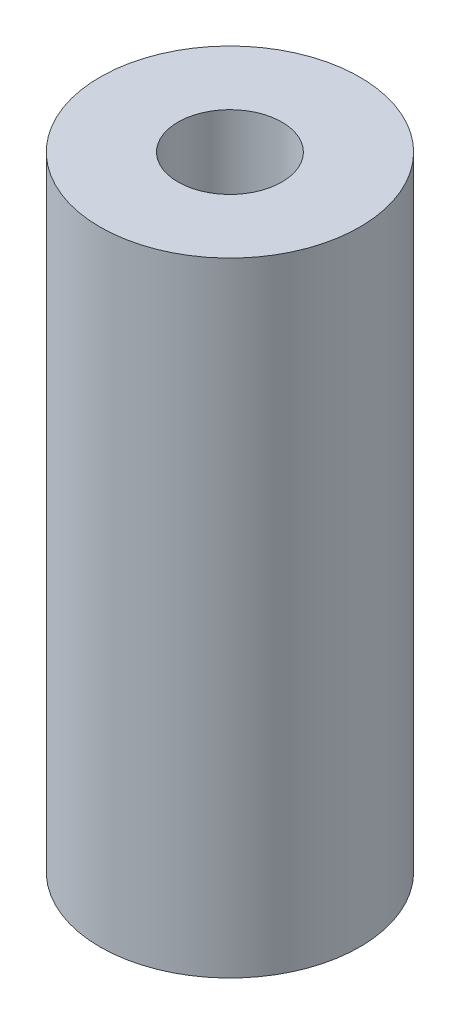
ISO-10303-21;
HEADER;
FILE_DESCRIPTION(('STEP AP214'),'2;1');
FILE_NAME('part.step','',(''),(''),'','','');
FILE_SCHEMA(('AUTOMOTIVE_DESIGN { 1 0 10303 214 1 1 1 1 }'));
ENDSEC;
DATA;
#1=APPLICATION_CONTEXT('core data for automotive mechanical design processes');
#2=APPLICATION_PROTOCOL_DEFINITION('international standard','automotive_design',2000,#1);
#3=PRODUCT_CONTEXT('',#1,'mechanical');
#4=PRODUCT('Part','Part','',(#3));
#5=PRODUCT_RELATED_PRODUCT_CATEGORY('part','',(#4));
#6=PRODUCT_DEFINITION_FORMATION('','',#4);
#7=PRODUCT_DEFINITION_CONTEXT('part definition',#1,'design');
#8=PRODUCT_DEFINITION('design','',#6,#7);
#9=PRODUCT_DEFINITION_SHAPE('','',#8);
#10=(LENGTH_UNIT() NAMED_UNIT(*) SI_UNIT(.MILLI.,.METRE.));
#11=(NAMED_UNIT(*) PLANE_ANGLE_UNIT() SI_UNIT($,.RADIAN.));
#12=(NAMED_UNIT(*) SI_UNIT($,.STERADIAN.) SOLID_ANGLE_UNIT());
#13=UNCERTAINTY_MEASURE_WITH_UNIT(LENGTH_MEASURE(1.E-05),#10,'distance_accuracy_value','');
#14=(GEOMETRIC_REPRESENTATION_CONTEXT(3) GLOBAL_UNCERTAINTY_ASSIGNED_CONTEXT((#13)) GLOBAL_UNIT_ASSIGNED_CONTEXT((#10,
#11,#12)) REPRESENTATION_CONTEXT('',''));
#15=CARTESIAN_POINT('',(0.,0.,0.));
#16=DIRECTION('',(0.,0.,1.));
#17=DIRECTION('',(1.,0.,0.));
#18=AXIS2_PLACEMENT_3D('',#15,#16,#17);
#19=CARTESIAN_POINT('',(5.,0.,0.));
#20=DIRECTION('',(0.,1.,0.));
#21=DIRECTION('',(0.,0.,1.));
#22=AXIS2_PLACEMENT_3D('',#19,#20,#21);
#23=PLANE('',#22);
#24=CARTESIAN_POINT('',(0.,0.,0.));
#25=DIRECTION('',(0.,1.,0.));
#26=DIRECTION('',(0.,0.,1.));
#27=AXIS2_PLACEMENT_3D('',#24,#25,#26);
#28=CIRCLE('',#27,5.);
#29=CARTESIAN_POINT('',(0.,0.,5.));
#30=VERTEX_POINT('',#29);
#31=EDGE_CURVE('E49',#30,#30,#28,.T.);
#32=ORIENTED_EDGE('',*,*,#31,.F.);
#33=EDGE_LOOP('',(#32));
#34=FACE_BOUND('',#33,.T.);
#35=CARTESIAN_POINT('',(0.,0.,0.));
#36=DIRECTION('',(0.,1.,0.));
#37=DIRECTION('',(0.,0.,1.));
#38=AXIS2_PLACEMENT_3D('',#35,#36,#37);
#39=CIRCLE('',#38,3.);
#40=CARTESIAN_POINT('',(0.,0.,3.));
#41=VERTEX_POINT('',#40);
#42=EDGE_CURVE('E10',#41,#41,#39,.T.);
#43=ORIENTED_EDGE('',*,*,#42,.T.);
#44=EDGE_LOOP('',(#43));
#45=FACE_BOUND('',#44,.T.);
#46=ADVANCED_FACE('F30',(#34,#45),#23,.F.);
#47=CARTESIAN_POINT('',(0.,10.8397414939025,0.));
#48=DIRECTION('',(0.,1.,0.));
#49=DIRECTION('',(0.,0.,1.));
#50=AXIS2_PLACEMENT_3D('',#47,#48,#49);
#51=CYLINDRICAL_SURFACE('',#50,3.);
#52=CARTESIAN_POINT('',(0.,13.,0.));
#53=DIRECTION('',(0.,-1.,0.));
#54=DIRECTION('',(0.,0.,-1.));
#55=AXIS2_PLACEMENT_3D('',#52,#53,#54);
#56=CIRCLE('',#55,3.);
#57=CARTESIAN_POINT('',(0.,13.,-3.));
#58=VERTEX_POINT('',#57);
#59=EDGE_CURVE('E52',#58,#58,#56,.T.);
#60=ORIENTED_EDGE('',*,*,#59,.F.);
#61=EDGE_LOOP('',(#60));
#62=FACE_BOUND('',#61,.T.);
#63=ORIENTED_EDGE('',*,*,#42,.F.);
#64=EDGE_LOOP('',(#63));
#65=FACE_BOUND('',#64,.T.);
#66=ADVANCED_FACE('F79',(#62,#65),#51,.F.);
#67=CARTESIAN_POINT('',(0.,10.8397414939025,0.));
#68=DIRECTION('',(0.,1.,0.));
#69=DIRECTION('',(0.,0.,1.));
#70=AXIS2_PLACEMENT_3D('',#67,#68,#69);
#71=CYLINDRICAL_SURFACE('',#70,2.);
#72=CARTESIAN_POINT('',(0.,18.,0.));
#73=DIRECTION('',(0.,1.,0.));
#74=DIRECTION('',(0.,0.,1.));
#75=AXIS2_PLACEMENT_3D('',#72,#73,#74);
#76=CIRCLE('',#75,2.);
#77=CARTESIAN_POINT('',(0.,18.,2.));
#78=VERTEX_POINT('',#77);
#79=EDGE_CURVE('E36',#78,#78,#76,.T.);
#80=ORIENTED_EDGE('',*,*,#79,.F.);
#81=EDGE_LOOP('',(#80));
#82=FACE_BOUND('',#81,.T.);
#83=CARTESIAN_POINT('',(0.,24.,0.));
#84=DIRECTION('',(0.,1.,0.));
#85=DIRECTION('',(0.,0.,1.));
#86=AXIS2_PLACEMENT_3D('',#83,#84,#85);
#87=CIRCLE('',#86,2.);
#88=CARTESIAN_POINT('',(0.,24.,2.));
#89=VERTEX_POINT('',#88);
#90=EDGE_CURVE('E40',#89,#89,#87,.T.);
#91=ORIENTED_EDGE('',*,*,#90,.T.);
#92=EDGE_LOOP('',(#91));
#93=FACE_BOUND('',#92,.T.);
#94=ADVANCED_FACE('F84',(#82,#93),#71,.F.);
#95=CARTESIAN_POINT('',(2.,24.,0.));
#96=DIRECTION('',(0.,-1.,0.));
#97=DIRECTION('',(0.,0.,-1.));
#98=AXIS2_PLACEMENT_3D('',#95,#96,#97);
#99=PLANE('',#98);
#100=ORIENTED_EDGE('',*,*,#90,.F.);
#101=EDGE_LOOP('',(#100));
#102=FACE_BOUND('',#101,.T.);
#103=CARTESIAN_POINT('',(0.,24.,0.));
#104=DIRECTION('',(0.,1.,0.));
#105=DIRECTION('',(0.,0.,1.));
#106=AXIS2_PLACEMENT_3D('',#103,#104,#105);
#107=CIRCLE('',#106,5.);
#108=CARTESIAN_POINT('',(0.,24.,5.));
#109=VERTEX_POINT('',#108);
#110=EDGE_CURVE('E44',#109,#109,#107,.T.);
#111=ORIENTED_EDGE('',*,*,#110,.T.);
#112=EDGE_LOOP('',(#111));
#113=FACE_BOUND('',#112,.T.);
#114=ADVANCED_FACE('F89',(#102,#113),#99,.F.);
#115=CARTESIAN_POINT('',(0.,10.8397414939025,0.));
#116=DIRECTION('',(0.,1.,0.));
#117=DIRECTION('',(0.,0.,1.));
#118=AXIS2_PLACEMENT_3D('',#115,#116,#117);
#119=CYLINDRICAL_SURFACE('',#118,5.);
#120=ORIENTED_EDGE('',*,*,#110,.F.);
#121=EDGE_LOOP('',(#120));
#122=FACE_BOUND('',#121,.T.);
#123=ORIENTED_EDGE('',*,*,#31,.T.);
#124=EDGE_LOOP('',(#123));
#125=FACE_BOUND('',#124,.T.);
#126=ADVANCED_FACE('F75',(#122,#125),#119,.T.);
#127=CARTESIAN_POINT('',(0.,18.,0.));
#128=DIRECTION('',(0.,-1.,0.));
#129=DIRECTION('',(0.,0.,-1.));
#130=AXIS2_PLACEMENT_3D('',#127,#128,#129);
#131=PLANE('',#130);
#132=CARTESIAN_POINT('',(0.,18.,0.));
#133=DIRECTION('',(0.,-1.,0.));
#134=DIRECTION('',(0.,0.,-1.));
#135=AXIS2_PLACEMENT_3D('',#132,#133,#134);
#136=CIRCLE('',#135,1.);
#137=CARTESIAN_POINT('',(0.,18.,-1.));
#138=VERTEX_POINT('',#137);
#139=EDGE_CURVE('E56',#138,#138,#136,.T.);
#140=ORIENTED_EDGE('',*,*,#139,.T.);
#141=EDGE_LOOP('',(#140));
#142=FACE_BOUND('',#141,.T.);
#143=ORIENTED_EDGE('',*,*,#79,.T.);
#144=EDGE_LOOP('',(#143));
#145=FACE_BOUND('',#144,.T.);
#146=ADVANCED_FACE('F67',(#142,#145),#131,.F.);
#147=CARTESIAN_POINT('',(0.,13.,0.));
#148=DIRECTION('',(0.,-1.,0.));
#149=DIRECTION('',(0.,0.,-1.));
#150=AXIS2_PLACEMENT_3D('',#147,#148,#149);
#151=PLANE('',#150);
#152=ORIENTED_EDGE('',*,*,#59,.T.);
#153=EDGE_LOOP('',(#152));
#154=FACE_BOUND('',#153,.T.);
#155=CARTESIAN_POINT('',(0.,13.,0.));
#156=DIRECTION('',(0.,-1.,0.));
#157=DIRECTION('',(0.,0.,-1.));
#158=AXIS2_PLACEMENT_3D('',#155,#156,#157);
#159=CIRCLE('',#158,1.);
#160=CARTESIAN_POINT('',(0.,13.,-1.));
#161=VERTEX_POINT('',#160);
#162=EDGE_CURVE('E55',#161,#161,#159,.T.);
#163=ORIENTED_EDGE('',*,*,#162,.F.);
#164=EDGE_LOOP('',(#163));
#165=FACE_BOUND('',#164,.T.);
#166=ADVANCED_FACE('F65',(#154,#165),#151,.T.);
#167=CARTESIAN_POINT('',(0.,13.,0.));
#168=DIRECTION('',(0.,1.,0.));
#169=DIRECTION('',(0.,0.,1.));
#170=AXIS2_PLACEMENT_3D('',#167,#168,#169);
#171=CYLINDRICAL_SURFACE('',#170,1.);
#172=ORIENTED_EDGE('',*,*,#162,.T.);
#173=EDGE_LOOP('',(#172));
#174=FACE_BOUND('',#173,.T.);
#175=ORIENTED_EDGE('',*,*,#139,.F.);
#176=EDGE_LOOP('',(#175));
#177=FACE_BOUND('',#176,.T.);
#178=ADVANCED_FACE('F62',(#174,#177),#171,.F.);
#179=CLOSED_SHELL('',(#46,#66,#94,#114,#126,#146,#166,#178));
#180=MANIFOLD_SOLID_BREP('B2',#179);
#181=ADVANCED_BREP_SHAPE_REPRESENTATION('',(#18,#180),#14);
#182=SHAPE_DEFINITION_REPRESENTATION(#9,#181);
ENDSEC;
END-ISO-10303-21;
